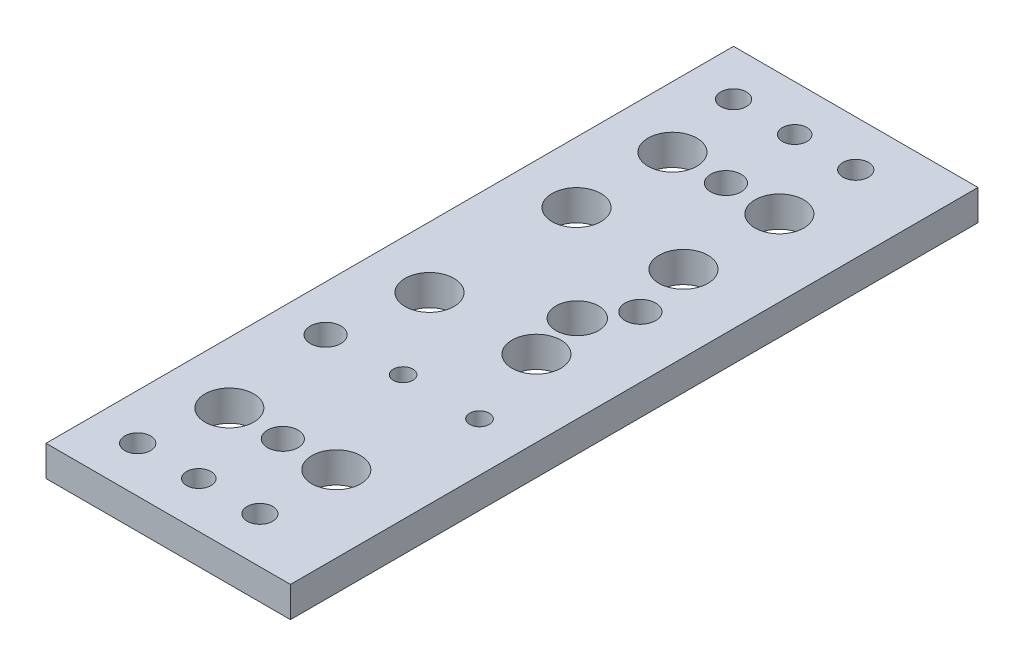
ISO-10303-21;
HEADER;
FILE_DESCRIPTION(('STEP AP214'),'2;1');
FILE_NAME('part.step','',(''),(''),'','','');
FILE_SCHEMA(('AUTOMOTIVE_DESIGN { 1 0 10303 214 1 1 1 1 }'));
ENDSEC;
DATA;
#1=APPLICATION_CONTEXT('core data for automotive mechanical design processes');
#2=APPLICATION_PROTOCOL_DEFINITION('international standard','automotive_design',2000,#1);
#3=PRODUCT_CONTEXT('',#1,'mechanical');
#4=PRODUCT('Part','Part','',(#3));
#5=PRODUCT_RELATED_PRODUCT_CATEGORY('part','',(#4));
#6=PRODUCT_DEFINITION_FORMATION('','',#4);
#7=PRODUCT_DEFINITION_CONTEXT('part definition',#1,'design');
#8=PRODUCT_DEFINITION('design','',#6,#7);
#9=PRODUCT_DEFINITION_SHAPE('','',#8);
#10=(LENGTH_UNIT() NAMED_UNIT(*) SI_UNIT(.MILLI.,.METRE.));
#11=(NAMED_UNIT(*) PLANE_ANGLE_UNIT() SI_UNIT($,.RADIAN.));
#12=(NAMED_UNIT(*) SI_UNIT($,.STERADIAN.) SOLID_ANGLE_UNIT());
#13=UNCERTAINTY_MEASURE_WITH_UNIT(LENGTH_MEASURE(1.E-05),#10,'distance_accuracy_value','');
#14=(GEOMETRIC_REPRESENTATION_CONTEXT(3) GLOBAL_UNCERTAINTY_ASSIGNED_CONTEXT((#13)) GLOBAL_UNIT_ASSIGNED_CONTEXT((#10,
#11,#12)) REPRESENTATION_CONTEXT('',''));
#15=CARTESIAN_POINT('',(0.,0.,0.));
#16=DIRECTION('',(0.,0.,1.));
#17=DIRECTION('',(1.,0.,0.));
#18=AXIS2_PLACEMENT_3D('',#15,#16,#17);
#19=CARTESIAN_POINT('',(40.,-10.,112.5));
#20=DIRECTION('',(1.,0.,0.));
#21=DIRECTION('',(0.,0.,-1.));
#22=AXIS2_PLACEMENT_3D('',#19,#20,#21);
#23=PLANE('',#22);
#24=DIRECTION('',(0.,0.,-1.));
#25=VECTOR('',#24,1.);
#26=CARTESIAN_POINT('',(40.,0.,112.5));
#27=LINE('',#26,#25);
#28=CARTESIAN_POINT('',(40.,0.,112.5));
#29=VERTEX_POINT('',#28);
#30=CARTESIAN_POINT('',(40.,0.,-112.5));
#31=VERTEX_POINT('',#30);
#32=EDGE_CURVE('E106',#29,#31,#27,.T.);
#33=ORIENTED_EDGE('',*,*,#32,.F.);
#34=DIRECTION('',(0.,1.,0.));
#35=VECTOR('',#34,1.);
#36=CARTESIAN_POINT('',(40.,-10.,112.5));
#37=LINE('',#36,#35);
#38=CARTESIAN_POINT('',(40.,-10.,112.5));
#39=VERTEX_POINT('',#38);
#40=EDGE_CURVE('E11',#39,#29,#37,.T.);
#41=ORIENTED_EDGE('',*,*,#40,.F.);
#42=DIRECTION('',(0.,0.,-1.));
#43=VECTOR('',#42,1.);
#44=CARTESIAN_POINT('',(40.,-10.,112.5));
#45=LINE('',#44,#43);
#46=CARTESIAN_POINT('',(40.,-10.,-112.5));
#47=VERTEX_POINT('',#46);
#48=EDGE_CURVE('E99',#39,#47,#45,.T.);
#49=ORIENTED_EDGE('',*,*,#48,.T.);
#50=DIRECTION('',(0.,1.,0.));
#51=VECTOR('',#50,1.);
#52=CARTESIAN_POINT('',(40.,-10.,-112.5));
#53=LINE('',#52,#51);
#54=EDGE_CURVE('E44',#47,#31,#53,.T.);
#55=ORIENTED_EDGE('',*,*,#54,.T.);
#56=EDGE_LOOP('',(#33,#41,#49,#55));
#57=FACE_BOUND('',#56,.T.);
#58=ADVANCED_FACE('F41',(#57),#23,.T.);
#59=CARTESIAN_POINT('',(-40.,-10.,112.5));
#60=DIRECTION('',(0.,0.,1.));
#61=DIRECTION('',(1.,0.,0.));
#62=AXIS2_PLACEMENT_3D('',#59,#60,#61);
#63=PLANE('',#62);
#64=DIRECTION('',(1.,0.,0.));
#65=VECTOR('',#64,1.);
#66=CARTESIAN_POINT('',(-40.,0.,112.5));
#67=LINE('',#66,#65);
#68=CARTESIAN_POINT('',(-40.,0.,112.5));
#69=VERTEX_POINT('',#68);
#70=EDGE_CURVE('E101',#69,#29,#67,.T.);
#71=ORIENTED_EDGE('',*,*,#70,.F.);
#72=DIRECTION('',(0.,1.,0.));
#73=VECTOR('',#72,1.);
#74=CARTESIAN_POINT('',(-40.,-10.,112.5));
#75=LINE('',#74,#73);
#76=CARTESIAN_POINT('',(-40.,-10.,112.5));
#77=VERTEX_POINT('',#76);
#78=EDGE_CURVE('E50',#77,#69,#75,.T.);
#79=ORIENTED_EDGE('',*,*,#78,.F.);
#80=DIRECTION('',(1.,0.,0.));
#81=VECTOR('',#80,1.);
#82=CARTESIAN_POINT('',(-40.,-10.,112.5));
#83=LINE('',#82,#81);
#84=EDGE_CURVE('E96',#77,#39,#83,.T.);
#85=ORIENTED_EDGE('',*,*,#84,.T.);
#86=ORIENTED_EDGE('',*,*,#40,.T.);
#87=EDGE_LOOP('',(#71,#79,#85,#86));
#88=FACE_BOUND('',#87,.T.);
#89=ADVANCED_FACE('F117',(#88),#63,.T.);
#90=CARTESIAN_POINT('',(-40.,-10.,112.5));
#91=DIRECTION('',(-1.,0.,0.));
#92=DIRECTION('',(0.,0.,1.));
#93=AXIS2_PLACEMENT_3D('',#90,#91,#92);
#94=PLANE('',#93);
#95=DIRECTION('',(0.,0.,1.));
#96=VECTOR('',#95,1.);
#97=CARTESIAN_POINT('',(-40.,0.,112.5));
#98=LINE('',#97,#96);
#99=CARTESIAN_POINT('',(-40.,0.,-112.5));
#100=VERTEX_POINT('',#99);
#101=EDGE_CURVE('E91',#100,#69,#98,.T.);
#102=ORIENTED_EDGE('',*,*,#101,.F.);
#103=DIRECTION('',(0.,1.,0.));
#104=VECTOR('',#103,1.);
#105=CARTESIAN_POINT('',(-40.,-10.,-112.5));
#106=LINE('',#105,#104);
#107=CARTESIAN_POINT('',(-40.,-10.,-112.5));
#108=VERTEX_POINT('',#107);
#109=EDGE_CURVE('E86',#108,#100,#106,.T.);
#110=ORIENTED_EDGE('',*,*,#109,.F.);
#111=DIRECTION('',(0.,0.,1.));
#112=VECTOR('',#111,1.);
#113=CARTESIAN_POINT('',(-40.,-10.,112.5));
#114=LINE('',#113,#112);
#115=EDGE_CURVE('E89',#108,#77,#114,.T.);
#116=ORIENTED_EDGE('',*,*,#115,.T.);
#117=ORIENTED_EDGE('',*,*,#78,.T.);
#118=EDGE_LOOP('',(#102,#110,#116,#117));
#119=FACE_BOUND('',#118,.T.);
#120=ADVANCED_FACE('F88',(#119),#94,.T.);
#121=CARTESIAN_POINT('',(-40.,-10.,-112.5));
#122=DIRECTION('',(0.,0.,-1.));
#123=DIRECTION('',(-1.,0.,0.));
#124=AXIS2_PLACEMENT_3D('',#121,#122,#123);
#125=PLANE('',#124);
#126=DIRECTION('',(-1.,0.,0.));
#127=VECTOR('',#126,1.);
#128=CARTESIAN_POINT('',(-40.,0.,-112.5));
#129=LINE('',#128,#127);
#130=EDGE_CURVE('E109',#31,#100,#129,.T.);
#131=ORIENTED_EDGE('',*,*,#130,.F.);
#132=ORIENTED_EDGE('',*,*,#54,.F.);
#133=DIRECTION('',(-1.,0.,0.));
#134=VECTOR('',#133,1.);
#135=CARTESIAN_POINT('',(-40.,-10.,-112.5));
#136=LINE('',#135,#134);
#137=EDGE_CURVE('E95',#47,#108,#136,.T.);
#138=ORIENTED_EDGE('',*,*,#137,.T.);
#139=ORIENTED_EDGE('',*,*,#109,.T.);
#140=EDGE_LOOP('',(#131,#132,#138,#139));
#141=FACE_BOUND('',#140,.T.);
#142=ADVANCED_FACE('F98',(#141),#125,.T.);
#143=CARTESIAN_POINT('',(0.,-10.,0.));
#144=DIRECTION('',(0.,-1.,0.));
#145=DIRECTION('',(0.,0.,-1.));
#146=AXIS2_PLACEMENT_3D('',#143,#144,#145);
#147=PLANE('',#146);
#148=CARTESIAN_POINT('',(11.5,-10.,-9.85999999999413));
#149=DIRECTION('',(0.,-1.,0.));
#150=DIRECTION('',(0.,0.,-1.));
#151=AXIS2_PLACEMENT_3D('',#148,#149,#150);
#152=CIRCLE('',#151,7.);
#153=CARTESIAN_POINT('',(11.5,-10.,-16.8599999999941));
#154=VERTEX_POINT('',#153);
#155=EDGE_CURVE('E226',#154,#154,#152,.F.);
#156=ORIENTED_EDGE('',*,*,#155,.T.);
#157=EDGE_LOOP('',(#156));
#158=FACE_BOUND('',#157,.T.);
#159=CARTESIAN_POINT('',(24.0000000000007,-10.,34.6400000000059));
#160=DIRECTION('',(0.,1.,0.));
#161=DIRECTION('',(0.,0.,1.));
#162=AXIS2_PLACEMENT_3D('',#159,#160,#161);
#163=CIRCLE('',#162,3.2);
#164=CARTESIAN_POINT('',(24.0000000000007,-10.,37.8400000000059));
#165=VERTEX_POINT('',#164);
#166=EDGE_CURVE('E233',#165,#165,#163,.T.);
#167=ORIENTED_EDGE('',*,*,#166,.T.);
#168=EDGE_LOOP('',(#167));
#169=FACE_BOUND('',#168,.T.);
#170=CARTESIAN_POINT('',(-0.999999999999269,-10.,34.6400000000059));
#171=DIRECTION('',(0.,1.,0.));
#172=DIRECTION('',(0.,0.,1.));
#173=AXIS2_PLACEMENT_3D('',#170,#171,#172);
#174=CIRCLE('',#173,3.2);
#175=CARTESIAN_POINT('',(-0.999999999999269,-10.,37.8400000000059));
#176=VERTEX_POINT('',#175);
#177=EDGE_CURVE('E242',#176,#176,#174,.T.);
#178=ORIENTED_EDGE('',*,*,#177,.T.);
#179=EDGE_LOOP('',(#178));
#180=FACE_BOUND('',#179,.T.);
#181=CARTESIAN_POINT('',(-2.49999999999989,-10.,72.5));
#182=DIRECTION('',(0.,1.,0.));
#183=DIRECTION('',(0.,0.,1.));
#184=AXIS2_PLACEMENT_3D('',#181,#182,#183);
#185=CIRCLE('',#184,5.);
#186=CARTESIAN_POINT('',(-2.49999999999989,-10.,77.5));
#187=VERTEX_POINT('',#186);
#188=EDGE_CURVE('E248',#187,#187,#185,.T.);
#189=ORIENTED_EDGE('',*,*,#188,.T.);
#190=EDGE_LOOP('',(#189));
#191=FACE_BOUND('',#190,.T.);
#192=CARTESIAN_POINT('',(-2.49999999999989,-10.,-72.5));
#193=DIRECTION('',(0.,1.,0.));
#194=DIRECTION('',(0.,0.,1.));
#195=AXIS2_PLACEMENT_3D('',#192,#193,#194);
#196=CIRCLE('',#195,5.);
#197=CARTESIAN_POINT('',(-2.49999999999989,-10.,-67.5));
#198=VERTEX_POINT('',#197);
#199=EDGE_CURVE('E254',#198,#198,#196,.T.);
#200=ORIENTED_EDGE('',*,*,#199,.T.);
#201=EDGE_LOOP('',(#200));
#202=FACE_BOUND('',#201,.T.);
#203=CARTESIAN_POINT('',(20.0000000000001,-10.,-22.));
#204=DIRECTION('',(0.,1.,0.));
#205=DIRECTION('',(0.,0.,1.));
#206=AXIS2_PLACEMENT_3D('',#203,#204,#205);
#207=CIRCLE('',#206,4.99999999999999);
#208=CARTESIAN_POINT('',(20.0000000000001,-10.,-17.));
#209=VERTEX_POINT('',#208);
#210=EDGE_CURVE('E260',#209,#209,#207,.T.);
#211=ORIENTED_EDGE('',*,*,#210,.T.);
#212=EDGE_LOOP('',(#211));
#213=FACE_BOUND('',#212,.T.);
#214=CARTESIAN_POINT('',(-24.9999999999999,-10.,36.));
#215=DIRECTION('',(0.,1.,0.));
#216=DIRECTION('',(0.,0.,1.));
#217=AXIS2_PLACEMENT_3D('',#214,#215,#216);
#218=CIRCLE('',#217,5.);
#219=CARTESIAN_POINT('',(-24.9999999999999,-10.,41.));
#220=VERTEX_POINT('',#219);
#221=EDGE_CURVE('E266',#220,#220,#218,.T.);
#222=ORIENTED_EDGE('',*,*,#221,.T.);
#223=EDGE_LOOP('',(#222));
#224=FACE_BOUND('',#223,.T.);
#225=CARTESIAN_POINT('',(-4.99999999999988,-10.,-97.5));
#226=DIRECTION('',(0.,1.,0.));
#227=DIRECTION('',(0.,0.,1.));
#228=AXIS2_PLACEMENT_3D('',#225,#226,#227);
#229=CIRCLE('',#228,4.);
#230=CARTESIAN_POINT('',(-4.99999999999988,-10.,-93.5));
#231=VERTEX_POINT('',#230);
#232=EDGE_CURVE('E272',#231,#231,#229,.T.);
#233=ORIENTED_EDGE('',*,*,#232,.T.);
#234=EDGE_LOOP('',(#233));
#235=FACE_BOUND('',#234,.T.);
#236=CARTESIAN_POINT('',(-4.99999999999988,-10.,97.5));
#237=DIRECTION('',(0.,1.,0.));
#238=DIRECTION('',(0.,0.,1.));
#239=AXIS2_PLACEMENT_3D('',#236,#237,#238);
#240=CIRCLE('',#239,4.);
#241=CARTESIAN_POINT('',(-4.99999999999988,-10.,101.5));
#242=VERTEX_POINT('',#241);
#243=EDGE_CURVE('E278',#242,#242,#240,.T.);
#244=ORIENTED_EDGE('',*,*,#243,.T.);
#245=EDGE_LOOP('',(#244));
#246=FACE_BOUND('',#245,.T.);
#247=CARTESIAN_POINT('',(-24.9999999999999,-10.,97.5));
#248=DIRECTION('',(0.,1.,0.));
#249=DIRECTION('',(0.,0.,1.));
#250=AXIS2_PLACEMENT_3D('',#247,#248,#249);
#251=CIRCLE('',#250,4.2);
#252=CARTESIAN_POINT('',(-24.9999999999999,-10.,101.7));
#253=VERTEX_POINT('',#252);
#254=EDGE_CURVE('E284',#253,#253,#251,.T.);
#255=ORIENTED_EDGE('',*,*,#254,.T.);
#256=EDGE_LOOP('',(#255));
#257=FACE_BOUND('',#256,.T.);
#258=CARTESIAN_POINT('',(15.0000000000001,-10.,97.5));
#259=DIRECTION('',(0.,1.,0.));
#260=DIRECTION('',(0.,0.,1.));
#261=AXIS2_PLACEMENT_3D('',#258,#259,#260);
#262=CIRCLE('',#261,4.2);
#263=CARTESIAN_POINT('',(15.0000000000001,-10.,101.7));
#264=VERTEX_POINT('',#263);
#265=EDGE_CURVE('E290',#264,#264,#262,.T.);
#266=ORIENTED_EDGE('',*,*,#265,.T.);
#267=EDGE_LOOP('',(#266));
#268=FACE_BOUND('',#267,.T.);
#269=CARTESIAN_POINT('',(15.0000000000001,-10.,-97.5));
#270=DIRECTION('',(0.,1.,0.));
#271=DIRECTION('',(0.,0.,1.));
#272=AXIS2_PLACEMENT_3D('',#269,#270,#271);
#273=CIRCLE('',#272,4.2);
#274=CARTESIAN_POINT('',(15.0000000000001,-10.,-93.3));
#275=VERTEX_POINT('',#274);
#276=EDGE_CURVE('E296',#275,#275,#273,.T.);
#277=ORIENTED_EDGE('',*,*,#276,.T.);
#278=EDGE_LOOP('',(#277));
#279=FACE_BOUND('',#278,.T.);
#280=CARTESIAN_POINT('',(-24.9999999999999,-10.,-97.5));
#281=DIRECTION('',(0.,1.,0.));
#282=DIRECTION('',(0.,0.,1.));
#283=AXIS2_PLACEMENT_3D('',#280,#281,#282);
#284=CIRCLE('',#283,4.2);
#285=CARTESIAN_POINT('',(-24.9999999999999,-10.,-93.3));
#286=VERTEX_POINT('',#285);
#287=EDGE_CURVE('E302',#286,#286,#284,.T.);
#288=ORIENTED_EDGE('',*,*,#287,.T.);
#289=EDGE_LOOP('',(#288));
#290=FACE_BOUND('',#289,.T.);
#291=CARTESIAN_POINT('',(15.0000000000001,-10.,-41.1099999999943));
#292=DIRECTION('',(0.,-1.,0.));
#293=DIRECTION('',(0.,0.,-1.));
#294=AXIS2_PLACEMENT_3D('',#291,#292,#293);
#295=CIRCLE('',#294,8.);
#296=CARTESIAN_POINT('',(15.0000000000001,-10.,-49.1099999999943));
#297=VERTEX_POINT('',#296);
#298=EDGE_CURVE('E324',#297,#297,#295,.F.);
#299=ORIENTED_EDGE('',*,*,#298,.T.);
#300=EDGE_LOOP('',(#299));
#301=FACE_BOUND('',#300,.T.);
#302=CARTESIAN_POINT('',(15.0000000000001,-10.,72.5));
#303=DIRECTION('',(0.,-1.,0.));
#304=DIRECTION('',(0.,0.,-1.));
#305=AXIS2_PLACEMENT_3D('',#302,#303,#304);
#306=CIRCLE('',#305,8.00000000000001);
#307=CARTESIAN_POINT('',(15.0000000000001,-10.,64.5));
#308=VERTEX_POINT('',#307);
#309=EDGE_CURVE('E331',#308,#308,#306,.F.);
#310=ORIENTED_EDGE('',*,*,#309,.T.);
#311=EDGE_LOOP('',(#310));
#312=FACE_BOUND('',#311,.T.);
#313=CARTESIAN_POINT('',(-19.9999999999999,-10.,72.5));
#314=DIRECTION('',(0.,-1.,0.));
#315=DIRECTION('',(0.,0.,-1.));
#316=AXIS2_PLACEMENT_3D('',#313,#314,#315);
#317=CIRCLE('',#316,8.00000000000001);
#318=CARTESIAN_POINT('',(-19.9999999999999,-10.,64.5));
#319=VERTEX_POINT('',#318);
#320=EDGE_CURVE('E337',#319,#319,#317,.F.);
#321=ORIENTED_EDGE('',*,*,#320,.T.);
#322=EDGE_LOOP('',(#321));
#323=FACE_BOUND('',#322,.T.);
#324=CARTESIAN_POINT('',(-19.9999999999999,-10.,7.));
#325=DIRECTION('',(0.,-1.,0.));
#326=DIRECTION('',(0.,0.,-1.));
#327=AXIS2_PLACEMENT_3D('',#324,#325,#326);
#328=CIRCLE('',#327,8.);
#329=CARTESIAN_POINT('',(-19.9999999999999,-10.,-1.00000000000001));
#330=VERTEX_POINT('',#329);
#331=EDGE_CURVE('E343',#330,#330,#328,.F.);
#332=ORIENTED_EDGE('',*,*,#331,.T.);
#333=EDGE_LOOP('',(#332));
#334=FACE_BOUND('',#333,.T.);
#335=CARTESIAN_POINT('',(-19.9999999999999,-10.,-41.1099999999943));
#336=DIRECTION('',(0.,-1.,0.));
#337=DIRECTION('',(0.,0.,-1.));
#338=AXIS2_PLACEMENT_3D('',#335,#336,#337);
#339=CIRCLE('',#338,8.);
#340=CARTESIAN_POINT('',(-19.9999999999999,-10.,-49.1099999999943));
#341=VERTEX_POINT('',#340);
#342=EDGE_CURVE('E306',#341,#341,#339,.F.);
#343=ORIENTED_EDGE('',*,*,#342,.T.);
#344=EDGE_LOOP('',(#343));
#345=FACE_BOUND('',#344,.T.);
#346=CARTESIAN_POINT('',(-19.9999999999999,-10.,-72.5));
#347=DIRECTION('',(0.,-1.,0.));
#348=DIRECTION('',(0.,0.,-1.));
#349=AXIS2_PLACEMENT_3D('',#346,#347,#348);
#350=CIRCLE('',#349,8.00000000000001);
#351=CARTESIAN_POINT('',(-19.9999999999999,-10.,-80.5));
#352=VERTEX_POINT('',#351);
#353=EDGE_CURVE('E313',#352,#352,#350,.F.);
#354=ORIENTED_EDGE('',*,*,#353,.T.);
#355=EDGE_LOOP('',(#354));
#356=FACE_BOUND('',#355,.T.);
#357=CARTESIAN_POINT('',(15.0000000000001,-10.,-72.5));
#358=DIRECTION('',(0.,-1.,0.));
#359=DIRECTION('',(0.,0.,-1.));
#360=AXIS2_PLACEMENT_3D('',#357,#358,#359);
#361=CIRCLE('',#360,8.00000000000003);
#362=CARTESIAN_POINT('',(15.0000000000001,-10.,-80.5));
#363=VERTEX_POINT('',#362);
#364=EDGE_CURVE('E319',#363,#363,#361,.F.);
#365=ORIENTED_EDGE('',*,*,#364,.T.);
#366=EDGE_LOOP('',(#365));
#367=FACE_BOUND('',#366,.T.);
#368=CARTESIAN_POINT('',(15.0000000000001,-10.,7.));
#369=DIRECTION('',(0.,-1.,0.));
#370=DIRECTION('',(0.,0.,-1.));
#371=AXIS2_PLACEMENT_3D('',#368,#369,#370);
#372=CIRCLE('',#371,8.);
#373=CARTESIAN_POINT('',(15.0000000000001,-10.,-1.00000000000001));
#374=VERTEX_POINT('',#373);
#375=EDGE_CURVE('E327',#374,#374,#372,.F.);
#376=ORIENTED_EDGE('',*,*,#375,.T.);
#377=EDGE_LOOP('',(#376));
#378=FACE_BOUND('',#377,.T.);
#379=ORIENTED_EDGE('',*,*,#48,.F.);
#380=ORIENTED_EDGE('',*,*,#84,.F.);
#381=ORIENTED_EDGE('',*,*,#115,.F.);
#382=ORIENTED_EDGE('',*,*,#137,.F.);
#383=EDGE_LOOP('',(#379,#380,#381,#382));
#384=FACE_BOUND('',#383,.T.);
#385=ADVANCED_FACE('F94',(#158,#169,#180,#191,#202,#213,#224,#235,#246,#257,#268,#279,#290,#301,
#312,#323,#334,#345,#356,#367,#378,#384),#147,.T.);
#386=CARTESIAN_POINT('',(0.,0.,0.));
#387=DIRECTION('',(0.,-1.,0.));
#388=DIRECTION('',(0.,0.,-1.));
#389=AXIS2_PLACEMENT_3D('',#386,#387,#388);
#390=PLANE('',#389);
#391=CARTESIAN_POINT('',(11.5,0.,-9.85999999999413));
#392=DIRECTION('',(0.,1.,0.));
#393=DIRECTION('',(0.,0.,1.));
#394=AXIS2_PLACEMENT_3D('',#391,#392,#393);
#395=CIRCLE('',#394,7.);
#396=CARTESIAN_POINT('',(11.5,0.,-2.85999999999413));
#397=VERTEX_POINT('',#396);
#398=EDGE_CURVE('E229',#397,#397,#395,.T.);
#399=ORIENTED_EDGE('',*,*,#398,.F.);
#400=EDGE_LOOP('',(#399));
#401=FACE_BOUND('',#400,.T.);
#402=CARTESIAN_POINT('',(24.0000000000007,0.,34.6400000000059));
#403=DIRECTION('',(0.,1.,0.));
#404=DIRECTION('',(0.,0.,1.));
#405=AXIS2_PLACEMENT_3D('',#402,#403,#404);
#406=CIRCLE('',#405,3.2);
#407=CARTESIAN_POINT('',(24.0000000000007,0.,37.8400000000059));
#408=VERTEX_POINT('',#407);
#409=EDGE_CURVE('E230',#408,#408,#406,.T.);
#410=ORIENTED_EDGE('',*,*,#409,.F.);
#411=EDGE_LOOP('',(#410));
#412=FACE_BOUND('',#411,.T.);
#413=CARTESIAN_POINT('',(-0.999999999999269,0.,34.6400000000059));
#414=DIRECTION('',(0.,1.,0.));
#415=DIRECTION('',(0.,0.,1.));
#416=AXIS2_PLACEMENT_3D('',#413,#414,#415);
#417=CIRCLE('',#416,3.2);
#418=CARTESIAN_POINT('',(-0.999999999999269,0.,37.8400000000059));
#419=VERTEX_POINT('',#418);
#420=EDGE_CURVE('E239',#419,#419,#417,.T.);
#421=ORIENTED_EDGE('',*,*,#420,.F.);
#422=EDGE_LOOP('',(#421));
#423=FACE_BOUND('',#422,.T.);
#424=CARTESIAN_POINT('',(-2.49999999999989,0.,72.5));
#425=DIRECTION('',(0.,1.,0.));
#426=DIRECTION('',(0.,0.,1.));
#427=AXIS2_PLACEMENT_3D('',#424,#425,#426);
#428=CIRCLE('',#427,5.);
#429=CARTESIAN_POINT('',(-2.49999999999989,0.,77.5));
#430=VERTEX_POINT('',#429);
#431=EDGE_CURVE('E245',#430,#430,#428,.T.);
#432=ORIENTED_EDGE('',*,*,#431,.F.);
#433=EDGE_LOOP('',(#432));
#434=FACE_BOUND('',#433,.T.);
#435=CARTESIAN_POINT('',(-2.49999999999989,0.,-72.5));
#436=DIRECTION('',(0.,1.,0.));
#437=DIRECTION('',(0.,0.,1.));
#438=AXIS2_PLACEMENT_3D('',#435,#436,#437);
#439=CIRCLE('',#438,5.);
#440=CARTESIAN_POINT('',(-2.49999999999989,0.,-67.5));
#441=VERTEX_POINT('',#440);
#442=EDGE_CURVE('E251',#441,#441,#439,.T.);
#443=ORIENTED_EDGE('',*,*,#442,.F.);
#444=EDGE_LOOP('',(#443));
#445=FACE_BOUND('',#444,.T.);
#446=CARTESIAN_POINT('',(20.0000000000001,0.,-22.));
#447=DIRECTION('',(0.,1.,0.));
#448=DIRECTION('',(0.,0.,1.));
#449=AXIS2_PLACEMENT_3D('',#446,#447,#448);
#450=CIRCLE('',#449,5.);
#451=CARTESIAN_POINT('',(20.0000000000001,0.,-17.));
#452=VERTEX_POINT('',#451);
#453=EDGE_CURVE('E257',#452,#452,#450,.T.);
#454=ORIENTED_EDGE('',*,*,#453,.F.);
#455=EDGE_LOOP('',(#454));
#456=FACE_BOUND('',#455,.T.);
#457=CARTESIAN_POINT('',(-24.9999999999999,0.,36.));
#458=DIRECTION('',(0.,1.,0.));
#459=DIRECTION('',(0.,0.,1.));
#460=AXIS2_PLACEMENT_3D('',#457,#458,#459);
#461=CIRCLE('',#460,5.);
#462=CARTESIAN_POINT('',(-24.9999999999999,0.,41.));
#463=VERTEX_POINT('',#462);
#464=EDGE_CURVE('E263',#463,#463,#461,.T.);
#465=ORIENTED_EDGE('',*,*,#464,.F.);
#466=EDGE_LOOP('',(#465));
#467=FACE_BOUND('',#466,.T.);
#468=CARTESIAN_POINT('',(-4.99999999999988,0.,-97.5));
#469=DIRECTION('',(0.,1.,0.));
#470=DIRECTION('',(0.,0.,1.));
#471=AXIS2_PLACEMENT_3D('',#468,#469,#470);
#472=CIRCLE('',#471,4.);
#473=CARTESIAN_POINT('',(-4.99999999999988,0.,-93.5));
#474=VERTEX_POINT('',#473);
#475=EDGE_CURVE('E269',#474,#474,#472,.T.);
#476=ORIENTED_EDGE('',*,*,#475,.F.);
#477=EDGE_LOOP('',(#476));
#478=FACE_BOUND('',#477,.T.);
#479=CARTESIAN_POINT('',(-4.99999999999988,0.,97.5));
#480=DIRECTION('',(0.,1.,0.));
#481=DIRECTION('',(0.,0.,1.));
#482=AXIS2_PLACEMENT_3D('',#479,#480,#481);
#483=CIRCLE('',#482,4.);
#484=CARTESIAN_POINT('',(-4.99999999999988,0.,101.5));
#485=VERTEX_POINT('',#484);
#486=EDGE_CURVE('E275',#485,#485,#483,.T.);
#487=ORIENTED_EDGE('',*,*,#486,.F.);
#488=EDGE_LOOP('',(#487));
#489=FACE_BOUND('',#488,.T.);
#490=CARTESIAN_POINT('',(-24.9999999999999,0.,97.5));
#491=DIRECTION('',(0.,1.,0.));
#492=DIRECTION('',(0.,0.,1.));
#493=AXIS2_PLACEMENT_3D('',#490,#491,#492);
#494=CIRCLE('',#493,4.2);
#495=CARTESIAN_POINT('',(-24.9999999999999,0.,101.7));
#496=VERTEX_POINT('',#495);
#497=EDGE_CURVE('E281',#496,#496,#494,.T.);
#498=ORIENTED_EDGE('',*,*,#497,.F.);
#499=EDGE_LOOP('',(#498));
#500=FACE_BOUND('',#499,.T.);
#501=CARTESIAN_POINT('',(15.0000000000001,0.,97.5));
#502=DIRECTION('',(0.,1.,0.));
#503=DIRECTION('',(0.,0.,1.));
#504=AXIS2_PLACEMENT_3D('',#501,#502,#503);
#505=CIRCLE('',#504,4.2);
#506=CARTESIAN_POINT('',(15.0000000000001,0.,101.7));
#507=VERTEX_POINT('',#506);
#508=EDGE_CURVE('E287',#507,#507,#505,.T.);
#509=ORIENTED_EDGE('',*,*,#508,.F.);
#510=EDGE_LOOP('',(#509));
#511=FACE_BOUND('',#510,.T.);
#512=CARTESIAN_POINT('',(15.0000000000001,0.,-97.5));
#513=DIRECTION('',(0.,1.,0.));
#514=DIRECTION('',(0.,0.,1.));
#515=AXIS2_PLACEMENT_3D('',#512,#513,#514);
#516=CIRCLE('',#515,4.2);
#517=CARTESIAN_POINT('',(15.0000000000001,0.,-93.3));
#518=VERTEX_POINT('',#517);
#519=EDGE_CURVE('E293',#518,#518,#516,.T.);
#520=ORIENTED_EDGE('',*,*,#519,.F.);
#521=EDGE_LOOP('',(#520));
#522=FACE_BOUND('',#521,.T.);
#523=CARTESIAN_POINT('',(-24.9999999999999,0.,-97.5));
#524=DIRECTION('',(0.,1.,0.));
#525=DIRECTION('',(0.,0.,1.));
#526=AXIS2_PLACEMENT_3D('',#523,#524,#525);
#527=CIRCLE('',#526,4.2);
#528=CARTESIAN_POINT('',(-24.9999999999999,0.,-93.3));
#529=VERTEX_POINT('',#528);
#530=EDGE_CURVE('E299',#529,#529,#527,.T.);
#531=ORIENTED_EDGE('',*,*,#530,.F.);
#532=EDGE_LOOP('',(#531));
#533=FACE_BOUND('',#532,.T.);
#534=CARTESIAN_POINT('',(15.0000000000001,0.,-41.1099999999943));
#535=DIRECTION('',(0.,1.,0.));
#536=DIRECTION('',(0.,0.,1.));
#537=AXIS2_PLACEMENT_3D('',#534,#535,#536);
#538=CIRCLE('',#537,8.);
#539=CARTESIAN_POINT('',(15.0000000000001,0.,-33.1099999999943));
#540=VERTEX_POINT('',#539);
#541=EDGE_CURVE('E328',#540,#540,#538,.T.);
#542=ORIENTED_EDGE('',*,*,#541,.F.);
#543=EDGE_LOOP('',(#542));
#544=FACE_BOUND('',#543,.T.);
#545=CARTESIAN_POINT('',(15.0000000000001,0.,72.5));
#546=DIRECTION('',(0.,1.,0.));
#547=DIRECTION('',(0.,0.,1.));
#548=AXIS2_PLACEMENT_3D('',#545,#546,#547);
#549=CIRCLE('',#548,8.00000000000001);
#550=CARTESIAN_POINT('',(15.0000000000001,0.,80.5));
#551=VERTEX_POINT('',#550);
#552=EDGE_CURVE('E334',#551,#551,#549,.T.);
#553=ORIENTED_EDGE('',*,*,#552,.F.);
#554=EDGE_LOOP('',(#553));
#555=FACE_BOUND('',#554,.T.);
#556=CARTESIAN_POINT('',(-19.9999999999999,0.,72.5));
#557=DIRECTION('',(0.,1.,0.));
#558=DIRECTION('',(0.,0.,1.));
#559=AXIS2_PLACEMENT_3D('',#556,#557,#558);
#560=CIRCLE('',#559,8.00000000000001);
#561=CARTESIAN_POINT('',(-19.9999999999999,0.,80.5));
#562=VERTEX_POINT('',#561);
#563=EDGE_CURVE('E340',#562,#562,#560,.T.);
#564=ORIENTED_EDGE('',*,*,#563,.F.);
#565=EDGE_LOOP('',(#564));
#566=FACE_BOUND('',#565,.T.);
#567=CARTESIAN_POINT('',(-19.9999999999999,0.,7.));
#568=DIRECTION('',(0.,1.,0.));
#569=DIRECTION('',(0.,0.,1.));
#570=AXIS2_PLACEMENT_3D('',#567,#568,#569);
#571=CIRCLE('',#570,8.);
#572=CARTESIAN_POINT('',(-19.9999999999999,0.,15.));
#573=VERTEX_POINT('',#572);
#574=EDGE_CURVE('E309',#573,#573,#571,.T.);
#575=ORIENTED_EDGE('',*,*,#574,.F.);
#576=EDGE_LOOP('',(#575));
#577=FACE_BOUND('',#576,.T.);
#578=CARTESIAN_POINT('',(-19.9999999999999,0.,-41.1099999999943));
#579=DIRECTION('',(0.,1.,0.));
#580=DIRECTION('',(0.,0.,1.));
#581=AXIS2_PLACEMENT_3D('',#578,#579,#580);
#582=CIRCLE('',#581,8.);
#583=CARTESIAN_POINT('',(-19.9999999999999,0.,-33.1099999999943));
#584=VERTEX_POINT('',#583);
#585=EDGE_CURVE('E310',#584,#584,#582,.T.);
#586=ORIENTED_EDGE('',*,*,#585,.F.);
#587=EDGE_LOOP('',(#586));
#588=FACE_BOUND('',#587,.T.);
#589=CARTESIAN_POINT('',(-19.9999999999999,0.,-72.5));
#590=DIRECTION('',(0.,1.,0.));
#591=DIRECTION('',(0.,0.,1.));
#592=AXIS2_PLACEMENT_3D('',#589,#590,#591);
#593=CIRCLE('',#592,8.00000000000001);
#594=CARTESIAN_POINT('',(-19.9999999999999,0.,-64.5));
#595=VERTEX_POINT('',#594);
#596=EDGE_CURVE('E316',#595,#595,#593,.T.);
#597=ORIENTED_EDGE('',*,*,#596,.F.);
#598=EDGE_LOOP('',(#597));
#599=FACE_BOUND('',#598,.T.);
#600=CARTESIAN_POINT('',(15.0000000000001,0.,-72.5));
#601=DIRECTION('',(0.,1.,0.));
#602=DIRECTION('',(0.,0.,1.));
#603=AXIS2_PLACEMENT_3D('',#600,#601,#602);
#604=CIRCLE('',#603,8.00000000000003);
#605=CARTESIAN_POINT('',(15.0000000000001,0.,-64.5));
#606=VERTEX_POINT('',#605);
#607=EDGE_CURVE('E305',#606,#606,#604,.T.);
#608=ORIENTED_EDGE('',*,*,#607,.F.);
#609=EDGE_LOOP('',(#608));
#610=FACE_BOUND('',#609,.T.);
#611=CARTESIAN_POINT('',(15.0000000000001,0.,7.));
#612=DIRECTION('',(0.,1.,0.));
#613=DIRECTION('',(0.,0.,1.));
#614=AXIS2_PLACEMENT_3D('',#611,#612,#613);
#615=CIRCLE('',#614,8.);
#616=CARTESIAN_POINT('',(15.0000000000001,0.,15.));
#617=VERTEX_POINT('',#616);
#618=EDGE_CURVE('E110',#617,#617,#615,.T.);
#619=ORIENTED_EDGE('',*,*,#618,.F.);
#620=EDGE_LOOP('',(#619));
#621=FACE_BOUND('',#620,.T.);
#622=ORIENTED_EDGE('',*,*,#32,.T.);
#623=ORIENTED_EDGE('',*,*,#130,.T.);
#624=ORIENTED_EDGE('',*,*,#101,.T.);
#625=ORIENTED_EDGE('',*,*,#70,.T.);
#626=EDGE_LOOP('',(#622,#623,#624,#625));
#627=FACE_BOUND('',#626,.T.);
#628=ADVANCED_FACE('F116',(#401,#412,#423,#434,#445,#456,#467,#478,#489,#500,#511,#522,#533,
#544,#555,#566,#577,#588,#599,#610,#621,#627),#390,.F.);
#629=CARTESIAN_POINT('',(15.0000000000001,-10.001,7.));
#630=DIRECTION('',(0.,1.,0.));
#631=DIRECTION('',(0.,0.,1.));
#632=AXIS2_PLACEMENT_3D('',#629,#630,#631);
#633=CYLINDRICAL_SURFACE('',#632,8.);
#634=ORIENTED_EDGE('',*,*,#375,.F.);
#635=EDGE_LOOP('',(#634));
#636=FACE_BOUND('',#635,.T.);
#637=ORIENTED_EDGE('',*,*,#618,.T.);
#638=EDGE_LOOP('',(#637));
#639=FACE_BOUND('',#638,.T.);
#640=ADVANCED_FACE('F137',(#636,#639),#633,.F.);
#641=CARTESIAN_POINT('',(15.0000000000001,-10.001,-72.5));
#642=DIRECTION('',(0.,1.,0.));
#643=DIRECTION('',(0.,0.,1.));
#644=AXIS2_PLACEMENT_3D('',#641,#642,#643);
#645=CYLINDRICAL_SURFACE('',#644,8.00000000000003);
#646=ORIENTED_EDGE('',*,*,#364,.F.);
#647=EDGE_LOOP('',(#646));
#648=FACE_BOUND('',#647,.T.);
#649=ORIENTED_EDGE('',*,*,#607,.T.);
#650=EDGE_LOOP('',(#649));
#651=FACE_BOUND('',#650,.T.);
#652=ADVANCED_FACE('F143',(#648,#651),#645,.F.);
#653=CARTESIAN_POINT('',(-19.9999999999999,-10.001,-72.5));
#654=DIRECTION('',(0.,1.,0.));
#655=DIRECTION('',(0.,0.,1.));
#656=AXIS2_PLACEMENT_3D('',#653,#654,#655);
#657=CYLINDRICAL_SURFACE('',#656,8.00000000000001);
#658=ORIENTED_EDGE('',*,*,#353,.F.);
#659=EDGE_LOOP('',(#658));
#660=FACE_BOUND('',#659,.T.);
#661=ORIENTED_EDGE('',*,*,#596,.T.);
#662=EDGE_LOOP('',(#661));
#663=FACE_BOUND('',#662,.T.);
#664=ADVANCED_FACE('F165',(#660,#663),#657,.F.);
#665=CARTESIAN_POINT('',(-19.9999999999999,-10.001,-41.1099999999943));
#666=DIRECTION('',(0.,1.,0.));
#667=DIRECTION('',(0.,0.,1.));
#668=AXIS2_PLACEMENT_3D('',#665,#666,#667);
#669=CYLINDRICAL_SURFACE('',#668,8.);
#670=ORIENTED_EDGE('',*,*,#342,.F.);
#671=EDGE_LOOP('',(#670));
#672=FACE_BOUND('',#671,.T.);
#673=ORIENTED_EDGE('',*,*,#585,.T.);
#674=EDGE_LOOP('',(#673));
#675=FACE_BOUND('',#674,.T.);
#676=ADVANCED_FACE('F149',(#672,#675),#669,.F.);
#677=CARTESIAN_POINT('',(-19.9999999999999,-10.001,7.));
#678=DIRECTION('',(0.,1.,0.));
#679=DIRECTION('',(0.,0.,1.));
#680=AXIS2_PLACEMENT_3D('',#677,#678,#679);
#681=CYLINDRICAL_SURFACE('',#680,8.);
#682=ORIENTED_EDGE('',*,*,#331,.F.);
#683=EDGE_LOOP('',(#682));
#684=FACE_BOUND('',#683,.T.);
#685=ORIENTED_EDGE('',*,*,#574,.T.);
#686=EDGE_LOOP('',(#685));
#687=FACE_BOUND('',#686,.T.);
#688=ADVANCED_FACE('F145',(#684,#687),#681,.F.);
#689=CARTESIAN_POINT('',(-19.9999999999999,-10.001,72.5));
#690=DIRECTION('',(0.,1.,0.));
#691=DIRECTION('',(0.,0.,1.));
#692=AXIS2_PLACEMENT_3D('',#689,#690,#691);
#693=CYLINDRICAL_SURFACE('',#692,8.00000000000001);
#694=ORIENTED_EDGE('',*,*,#320,.F.);
#695=EDGE_LOOP('',(#694));
#696=FACE_BOUND('',#695,.T.);
#697=ORIENTED_EDGE('',*,*,#563,.T.);
#698=EDGE_LOOP('',(#697));
#699=FACE_BOUND('',#698,.T.);
#700=ADVANCED_FACE('F148',(#696,#699),#693,.F.);
#701=CARTESIAN_POINT('',(15.0000000000001,-10.001,72.5));
#702=DIRECTION('',(0.,1.,0.));
#703=DIRECTION('',(0.,0.,1.));
#704=AXIS2_PLACEMENT_3D('',#701,#702,#703);
#705=CYLINDRICAL_SURFACE('',#704,8.00000000000001);
#706=ORIENTED_EDGE('',*,*,#309,.F.);
#707=EDGE_LOOP('',(#706));
#708=FACE_BOUND('',#707,.T.);
#709=ORIENTED_EDGE('',*,*,#552,.T.);
#710=EDGE_LOOP('',(#709));
#711=FACE_BOUND('',#710,.T.);
#712=ADVANCED_FACE('F153',(#708,#711),#705,.F.);
#713=CARTESIAN_POINT('',(15.0000000000001,-10.001,-41.1099999999943));
#714=DIRECTION('',(0.,1.,0.));
#715=DIRECTION('',(0.,0.,1.));
#716=AXIS2_PLACEMENT_3D('',#713,#714,#715);
#717=CYLINDRICAL_SURFACE('',#716,8.);
#718=ORIENTED_EDGE('',*,*,#298,.F.);
#719=EDGE_LOOP('',(#718));
#720=FACE_BOUND('',#719,.T.);
#721=ORIENTED_EDGE('',*,*,#541,.T.);
#722=EDGE_LOOP('',(#721));
#723=FACE_BOUND('',#722,.T.);
#724=ADVANCED_FACE('F157',(#720,#723),#717,.F.);
#725=CARTESIAN_POINT('',(-24.9999999999999,0.,-97.5));
#726=DIRECTION('',(0.,1.,0.));
#727=DIRECTION('',(0.,0.,1.));
#728=AXIS2_PLACEMENT_3D('',#725,#726,#727);
#729=CYLINDRICAL_SURFACE('',#728,4.2);
#730=ORIENTED_EDGE('',*,*,#287,.F.);
#731=EDGE_LOOP('',(#730));
#732=FACE_BOUND('',#731,.T.);
#733=ORIENTED_EDGE('',*,*,#530,.T.);
#734=EDGE_LOOP('',(#733));
#735=FACE_BOUND('',#734,.T.);
#736=ADVANCED_FACE('F161',(#732,#735),#729,.F.);
#737=CARTESIAN_POINT('',(15.0000000000001,0.,-97.5));
#738=DIRECTION('',(0.,1.,0.));
#739=DIRECTION('',(0.,0.,1.));
#740=AXIS2_PLACEMENT_3D('',#737,#738,#739);
#741=CYLINDRICAL_SURFACE('',#740,4.2);
#742=ORIENTED_EDGE('',*,*,#276,.F.);
#743=EDGE_LOOP('',(#742));
#744=FACE_BOUND('',#743,.T.);
#745=ORIENTED_EDGE('',*,*,#519,.T.);
#746=EDGE_LOOP('',(#745));
#747=FACE_BOUND('',#746,.T.);
#748=ADVANCED_FACE('F175',(#744,#747),#741,.F.);
#749=CARTESIAN_POINT('',(15.0000000000001,0.,97.5));
#750=DIRECTION('',(0.,1.,0.));
#751=DIRECTION('',(0.,0.,1.));
#752=AXIS2_PLACEMENT_3D('',#749,#750,#751);
#753=CYLINDRICAL_SURFACE('',#752,4.2);
#754=ORIENTED_EDGE('',*,*,#265,.F.);
#755=EDGE_LOOP('',(#754));
#756=FACE_BOUND('',#755,.T.);
#757=ORIENTED_EDGE('',*,*,#508,.T.);
#758=EDGE_LOOP('',(#757));
#759=FACE_BOUND('',#758,.T.);
#760=ADVANCED_FACE('F179',(#756,#759),#753,.F.);
#761=CARTESIAN_POINT('',(-24.9999999999999,0.,97.5));
#762=DIRECTION('',(0.,1.,0.));
#763=DIRECTION('',(0.,0.,1.));
#764=AXIS2_PLACEMENT_3D('',#761,#762,#763);
#765=CYLINDRICAL_SURFACE('',#764,4.2);
#766=ORIENTED_EDGE('',*,*,#254,.F.);
#767=EDGE_LOOP('',(#766));
#768=FACE_BOUND('',#767,.T.);
#769=ORIENTED_EDGE('',*,*,#497,.T.);
#770=EDGE_LOOP('',(#769));
#771=FACE_BOUND('',#770,.T.);
#772=ADVANCED_FACE('F183',(#768,#771),#765,.F.);
#773=CARTESIAN_POINT('',(-4.99999999999988,0.,97.5));
#774=DIRECTION('',(0.,1.,0.));
#775=DIRECTION('',(0.,0.,1.));
#776=AXIS2_PLACEMENT_3D('',#773,#774,#775);
#777=CYLINDRICAL_SURFACE('',#776,4.);
#778=ORIENTED_EDGE('',*,*,#243,.F.);
#779=EDGE_LOOP('',(#778));
#780=FACE_BOUND('',#779,.T.);
#781=ORIENTED_EDGE('',*,*,#486,.T.);
#782=EDGE_LOOP('',(#781));
#783=FACE_BOUND('',#782,.T.);
#784=ADVANCED_FACE('F187',(#780,#783),#777,.F.);
#785=CARTESIAN_POINT('',(-4.99999999999988,0.,-97.5));
#786=DIRECTION('',(0.,1.,0.));
#787=DIRECTION('',(0.,0.,1.));
#788=AXIS2_PLACEMENT_3D('',#785,#786,#787);
#789=CYLINDRICAL_SURFACE('',#788,4.);
#790=ORIENTED_EDGE('',*,*,#232,.F.);
#791=EDGE_LOOP('',(#790));
#792=FACE_BOUND('',#791,.T.);
#793=ORIENTED_EDGE('',*,*,#475,.T.);
#794=EDGE_LOOP('',(#793));
#795=FACE_BOUND('',#794,.T.);
#796=ADVANCED_FACE('F191',(#792,#795),#789,.F.);
#797=CARTESIAN_POINT('',(-24.9999999999999,0.,36.));
#798=DIRECTION('',(0.,1.,0.));
#799=DIRECTION('',(0.,0.,1.));
#800=AXIS2_PLACEMENT_3D('',#797,#798,#799);
#801=CYLINDRICAL_SURFACE('',#800,5.);
#802=ORIENTED_EDGE('',*,*,#221,.F.);
#803=EDGE_LOOP('',(#802));
#804=FACE_BOUND('',#803,.T.);
#805=ORIENTED_EDGE('',*,*,#464,.T.);
#806=EDGE_LOOP('',(#805));
#807=FACE_BOUND('',#806,.T.);
#808=ADVANCED_FACE('F195',(#804,#807),#801,.F.);
#809=CARTESIAN_POINT('',(20.0000000000001,0.,-22.));
#810=DIRECTION('',(0.,1.,0.));
#811=DIRECTION('',(0.,0.,1.));
#812=AXIS2_PLACEMENT_3D('',#809,#810,#811);
#813=CYLINDRICAL_SURFACE('',#812,5.);
#814=ORIENTED_EDGE('',*,*,#210,.F.);
#815=EDGE_LOOP('',(#814));
#816=FACE_BOUND('',#815,.T.);
#817=ORIENTED_EDGE('',*,*,#453,.T.);
#818=EDGE_LOOP('',(#817));
#819=FACE_BOUND('',#818,.T.);
#820=ADVANCED_FACE('F199',(#816,#819),#813,.F.);
#821=CARTESIAN_POINT('',(-2.49999999999989,0.,-72.5));
#822=DIRECTION('',(0.,1.,0.));
#823=DIRECTION('',(0.,0.,1.));
#824=AXIS2_PLACEMENT_3D('',#821,#822,#823);
#825=CYLINDRICAL_SURFACE('',#824,5.);
#826=ORIENTED_EDGE('',*,*,#199,.F.);
#827=EDGE_LOOP('',(#826));
#828=FACE_BOUND('',#827,.T.);
#829=ORIENTED_EDGE('',*,*,#442,.T.);
#830=EDGE_LOOP('',(#829));
#831=FACE_BOUND('',#830,.T.);
#832=ADVANCED_FACE('F203',(#828,#831),#825,.F.);
#833=CARTESIAN_POINT('',(-2.49999999999989,0.,72.5));
#834=DIRECTION('',(0.,1.,0.));
#835=DIRECTION('',(0.,0.,1.));
#836=AXIS2_PLACEMENT_3D('',#833,#834,#835);
#837=CYLINDRICAL_SURFACE('',#836,5.);
#838=ORIENTED_EDGE('',*,*,#188,.F.);
#839=EDGE_LOOP('',(#838));
#840=FACE_BOUND('',#839,.T.);
#841=ORIENTED_EDGE('',*,*,#431,.T.);
#842=EDGE_LOOP('',(#841));
#843=FACE_BOUND('',#842,.T.);
#844=ADVANCED_FACE('F207',(#840,#843),#837,.F.);
#845=CARTESIAN_POINT('',(-0.999999999999269,0.,34.6400000000059));
#846=DIRECTION('',(0.,1.,0.));
#847=DIRECTION('',(0.,0.,1.));
#848=AXIS2_PLACEMENT_3D('',#845,#846,#847);
#849=CYLINDRICAL_SURFACE('',#848,3.2);
#850=ORIENTED_EDGE('',*,*,#177,.F.);
#851=EDGE_LOOP('',(#850));
#852=FACE_BOUND('',#851,.T.);
#853=ORIENTED_EDGE('',*,*,#420,.T.);
#854=EDGE_LOOP('',(#853));
#855=FACE_BOUND('',#854,.T.);
#856=ADVANCED_FACE('F211',(#852,#855),#849,.F.);
#857=CARTESIAN_POINT('',(24.0000000000007,0.,34.6400000000059));
#858=DIRECTION('',(0.,1.,0.));
#859=DIRECTION('',(0.,0.,1.));
#860=AXIS2_PLACEMENT_3D('',#857,#858,#859);
#861=CYLINDRICAL_SURFACE('',#860,3.2);
#862=ORIENTED_EDGE('',*,*,#166,.F.);
#863=EDGE_LOOP('',(#862));
#864=FACE_BOUND('',#863,.T.);
#865=ORIENTED_EDGE('',*,*,#409,.T.);
#866=EDGE_LOOP('',(#865));
#867=FACE_BOUND('',#866,.T.);
#868=ADVANCED_FACE('F215',(#864,#867),#861,.F.);
#869=CARTESIAN_POINT('',(11.5,-10.001,-9.85999999999413));
#870=DIRECTION('',(0.,1.,0.));
#871=DIRECTION('',(0.,0.,1.));
#872=AXIS2_PLACEMENT_3D('',#869,#870,#871);
#873=CYLINDRICAL_SURFACE('',#872,7.);
#874=ORIENTED_EDGE('',*,*,#155,.F.);
#875=EDGE_LOOP('',(#874));
#876=FACE_BOUND('',#875,.T.);
#877=ORIENTED_EDGE('',*,*,#398,.T.);
#878=EDGE_LOOP('',(#877));
#879=FACE_BOUND('',#878,.T.);
#880=ADVANCED_FACE('F218',(#876,#879),#873,.F.);
#881=CLOSED_SHELL('',(#58,#89,#120,#142,#385,#628,#640,#652,#664,#676,#688,#700,#712,#724,#736,
#748,#760,#772,#784,#796,#808,#820,#832,#844,#856,#868,#880));
#882=MANIFOLD_SOLID_BREP('B2',#881);
#883=ADVANCED_BREP_SHAPE_REPRESENTATION('',(#18,#882),#14);
#884=SHAPE_DEFINITION_REPRESENTATION(#9,#883);
ENDSEC;
END-ISO-10303-21;
